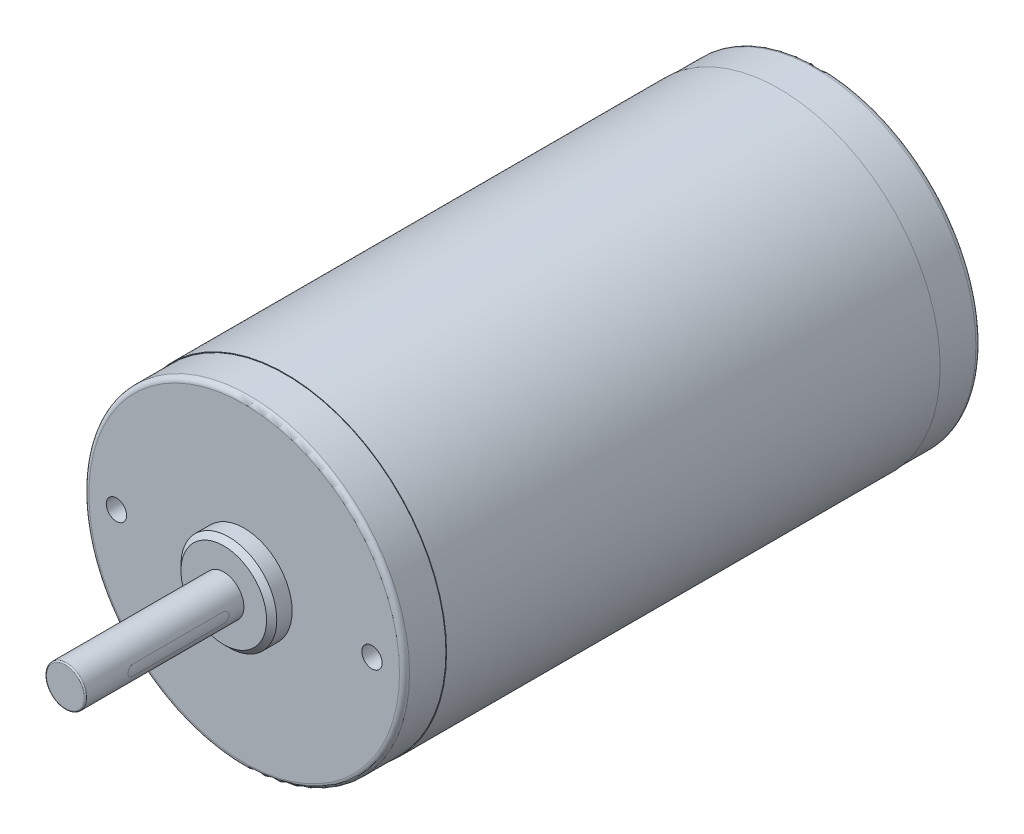
ISO-10303-21;
HEADER;
FILE_DESCRIPTION(('STEP AP214'),'2;1');
FILE_NAME('part.step','',(''),(''),'','','');
FILE_SCHEMA(('AUTOMOTIVE_DESIGN { 1 0 10303 214 1 1 1 1 }'));
ENDSEC;
DATA;
#1=APPLICATION_CONTEXT('core data for automotive mechanical design processes');
#2=APPLICATION_PROTOCOL_DEFINITION('international standard','automotive_design',2000,#1);
#3=PRODUCT_CONTEXT('',#1,'mechanical');
#4=PRODUCT('Part','Part','',(#3));
#5=PRODUCT_RELATED_PRODUCT_CATEGORY('part','',(#4));
#6=PRODUCT_DEFINITION_FORMATION('','',#4);
#7=PRODUCT_DEFINITION_CONTEXT('part definition',#1,'design');
#8=PRODUCT_DEFINITION('design','',#6,#7);
#9=PRODUCT_DEFINITION_SHAPE('','',#8);
#10=(LENGTH_UNIT() NAMED_UNIT(*) SI_UNIT(.MILLI.,.METRE.));
#11=(NAMED_UNIT(*) PLANE_ANGLE_UNIT() SI_UNIT($,.RADIAN.));
#12=(NAMED_UNIT(*) SI_UNIT($,.STERADIAN.) SOLID_ANGLE_UNIT());
#13=UNCERTAINTY_MEASURE_WITH_UNIT(LENGTH_MEASURE(1.E-05),#10,'distance_accuracy_value','');
#14=(GEOMETRIC_REPRESENTATION_CONTEXT(3) GLOBAL_UNCERTAINTY_ASSIGNED_CONTEXT((#13)) GLOBAL_UNIT_ASSIGNED_CONTEXT((#10,
#11,#12)) REPRESENTATION_CONTEXT('',''));
#15=CARTESIAN_POINT('',(0.,0.,0.));
#16=DIRECTION('',(0.,0.,1.));
#17=DIRECTION('',(1.,0.,0.));
#18=AXIS2_PLACEMENT_3D('',#15,#16,#17);
#19=CARTESIAN_POINT('',(35.56,109.2962,10.8204000000007));
#20=DIRECTION('',(0.,0.,-1.));
#21=DIRECTION('',(-1.,0.,0.));
#22=AXIS2_PLACEMENT_3D('',#19,#20,#21);
#23=CYLINDRICAL_SURFACE('',#22,32.0040000000005);
#24=CARTESIAN_POINT('',(35.56,109.2962,10.8204000000007));
#25=DIRECTION('',(0.,0.,-1.));
#26=DIRECTION('',(-1.,0.,0.));
#27=AXIS2_PLACEMENT_3D('',#24,#25,#26);
#28=CIRCLE('',#27,32.0040000000005);
#29=CARTESIAN_POINT('',(3.5559999999995,109.2962,10.8204000000007));
#30=VERTEX_POINT('',#29);
#31=EDGE_CURVE('P0_E179',#30,#30,#28,.T.);
#32=ORIENTED_EDGE('',*,*,#31,.T.);
#33=EDGE_LOOP('',(#32));
#34=FACE_BOUND('',#33,.T.);
#35=CARTESIAN_POINT('',(35.56,109.2962,-87.325199999998));
#36=DIRECTION('',(0.,0.,-1.));
#37=DIRECTION('',(-1.,0.,0.));
#38=AXIS2_PLACEMENT_3D('',#35,#36,#37);
#39=CIRCLE('',#38,32.0040000000005);
#40=CARTESIAN_POINT('',(3.5559999999995,109.2962,-87.325199999998));
#41=VERTEX_POINT('',#40);
#42=EDGE_CURVE('P0_E176',#41,#41,#39,.T.);
#43=ORIENTED_EDGE('',*,*,#42,.F.);
#44=EDGE_LOOP('',(#43));
#45=FACE_BOUND('',#44,.T.);
#46=ADVANCED_FACE('P0_F37',(#34,#45),#23,.T.);
#47=CARTESIAN_POINT('',(67.5640000000005,109.2962,10.8204000000007));
#48=DIRECTION('',(0.,0.,1.));
#49=DIRECTION('',(1.,0.,0.));
#50=AXIS2_PLACEMENT_3D('',#47,#48,#49);
#51=PLANE('',#50);
#52=CARTESIAN_POINT('',(35.56,109.2962,10.8204000000007));
#53=DIRECTION('',(0.,0.,1.));
#54=DIRECTION('',(1.,0.,0.));
#55=AXIS2_PLACEMENT_3D('',#52,#53,#54);
#56=CIRCLE('',#55,31.8770000000005);
#57=CARTESIAN_POINT('',(67.4370000000005,109.2962,10.8204000000007));
#58=VERTEX_POINT('',#57);
#59=EDGE_CURVE('P0_E167',#58,#58,#56,.T.);
#60=ORIENTED_EDGE('',*,*,#59,.F.);
#61=EDGE_LOOP('',(#60));
#62=FACE_BOUND('',#61,.T.);
#63=ORIENTED_EDGE('',*,*,#31,.F.);
#64=EDGE_LOOP('',(#63));
#65=FACE_BOUND('',#64,.T.);
#66=ADVANCED_FACE('P0_F226',(#62,#65),#51,.T.);
#67=CARTESIAN_POINT('',(35.56,109.2962,-87.325199999998));
#68=DIRECTION('',(0.,0.,-1.));
#69=DIRECTION('',(-1.,0.,0.));
#70=AXIS2_PLACEMENT_3D('',#67,#68,#69);
#71=PLANE('',#70);
#72=CARTESIAN_POINT('',(35.56,109.2962,-87.325199999998));
#73=DIRECTION('',(0.,0.,-1.));
#74=DIRECTION('',(-1.,0.,0.));
#75=AXIS2_PLACEMENT_3D('',#72,#73,#74);
#76=CIRCLE('',#75,31.8770000000005);
#77=CARTESIAN_POINT('',(3.68299999999951,109.2962,-87.325199999998));
#78=VERTEX_POINT('',#77);
#79=EDGE_CURVE('P0_E173',#78,#78,#76,.T.);
#80=ORIENTED_EDGE('',*,*,#79,.F.);
#81=EDGE_LOOP('',(#80));
#82=FACE_BOUND('',#81,.T.);
#83=ORIENTED_EDGE('',*,*,#42,.T.);
#84=EDGE_LOOP('',(#83));
#85=FACE_BOUND('',#84,.T.);
#86=ADVANCED_FACE('P0_F232',(#82,#85),#71,.T.);
#87=CARTESIAN_POINT('',(35.56,109.2962,-95.554799999998));
#88=DIRECTION('',(0.,0.,1.));
#89=DIRECTION('',(1.,0.,0.));
#90=AXIS2_PLACEMENT_3D('',#87,#88,#89);
#91=CYLINDRICAL_SURFACE('',#90,31.8770000000005);
#92=CARTESIAN_POINT('',(35.56,109.2962,-94.554799999998));
#93=DIRECTION('',(0.,0.,-1.));
#94=DIRECTION('',(-1.,0.,0.));
#95=AXIS2_PLACEMENT_3D('',#92,#93,#94);
#96=CIRCLE('',#95,31.8770000000005);
#97=CARTESIAN_POINT('',(3.68299999999951,109.2962,-94.554799999998));
#98=VERTEX_POINT('',#97);
#99=EDGE_CURVE('P0_E209',#98,#98,#96,.F.);
#100=ORIENTED_EDGE('',*,*,#99,.T.);
#101=EDGE_LOOP('',(#100));
#102=FACE_BOUND('',#101,.T.);
#103=ORIENTED_EDGE('',*,*,#79,.T.);
#104=EDGE_LOOP('',(#103));
#105=FACE_BOUND('',#104,.T.);
#106=ADVANCED_FACE('P0_F290',(#102,#105),#91,.T.);
#107=CARTESIAN_POINT('',(35.56,109.2962,-95.554799999998));
#108=DIRECTION('',(0.,0.,-1.));
#109=DIRECTION('',(-1.,0.,0.));
#110=AXIS2_PLACEMENT_3D('',#107,#108,#109);
#111=PLANE('',#110);
#112=CARTESIAN_POINT('',(35.56,109.2962,-95.554799999998));
#113=DIRECTION('',(0.,0.,-1.));
#114=DIRECTION('',(-1.,0.,0.));
#115=AXIS2_PLACEMENT_3D('',#112,#113,#114);
#116=CIRCLE('',#115,30.8770000000005);
#117=CARTESIAN_POINT('',(4.6829999999995,109.2962,-95.554799999998));
#118=VERTEX_POINT('',#117);
#119=EDGE_CURVE('P0_E206',#118,#118,#116,.T.);
#120=ORIENTED_EDGE('',*,*,#119,.T.);
#121=EDGE_LOOP('',(#120));
#122=FACE_BOUND('',#121,.T.);
#123=CARTESIAN_POINT('',(46.76735963712,127.903290682857,-95.554799999998));
#124=DIRECTION('',(0.,0.,-1.));
#125=DIRECTION('',(-1.,0.,0.));
#126=AXIS2_PLACEMENT_3D('',#123,#124,#125);
#127=CIRCLE('',#126,4.31800000197918);
#128=CARTESIAN_POINT('',(42.4493596351408,127.903290682857,-95.554799999998));
#129=VERTEX_POINT('',#128);
#130=EDGE_CURVE('P0_E185',#129,#129,#127,.T.);
#131=ORIENTED_EDGE('',*,*,#130,.F.);
#132=EDGE_LOOP('',(#131));
#133=FACE_BOUND('',#132,.T.);
#134=CARTESIAN_POINT('',(54.1670906808811,120.503559639095,-95.554799999998));
#135=DIRECTION('',(0.,0.,-1.));
#136=DIRECTION('',(-1.,0.,0.));
#137=AXIS2_PLACEMENT_3D('',#134,#135,#136);
#138=CIRCLE('',#137,4.3180000019652);
#139=CARTESIAN_POINT('',(49.8490906789159,120.503559639095,-95.554799999998));
#140=VERTEX_POINT('',#139);
#141=EDGE_CURVE('P0_E182',#140,#140,#138,.T.);
#142=ORIENTED_EDGE('',*,*,#141,.F.);
#143=EDGE_LOOP('',(#142));
#144=FACE_BOUND('',#143,.T.);
#145=CARTESIAN_POINT('',(35.56,109.2962,-95.554799999998));
#146=DIRECTION('',(0.,0.,-1.));
#147=DIRECTION('',(-1.,0.,0.));
#148=AXIS2_PLACEMENT_3D('',#145,#146,#147);
#149=CIRCLE('',#148,15.0368000000003);
#150=CARTESIAN_POINT('',(20.5231999999997,109.2962,-95.554799999998));
#151=VERTEX_POINT('',#150);
#152=EDGE_CURVE('P0_E170',#151,#151,#149,.T.);
#153=ORIENTED_EDGE('',*,*,#152,.F.);
#154=EDGE_LOOP('',(#153));
#155=FACE_BOUND('',#154,.T.);
#156=ADVANCED_FACE('P0_F286',(#122,#133,#144,#155),#111,.T.);
#157=CARTESIAN_POINT('',(35.56,109.2962,-100.317299999998));
#158=DIRECTION('',(0.,0.,1.));
#159=DIRECTION('',(1.,0.,0.));
#160=AXIS2_PLACEMENT_3D('',#157,#158,#159);
#161=CYLINDRICAL_SURFACE('',#160,15.0368000000003);
#162=CARTESIAN_POINT('',(35.56,109.2962,-99.317299999998));
#163=DIRECTION('',(0.,0.,-1.));
#164=DIRECTION('',(-1.,0.,0.));
#165=AXIS2_PLACEMENT_3D('',#162,#163,#164);
#166=CIRCLE('',#165,15.0368000000003);
#167=CARTESIAN_POINT('',(20.5231999999997,109.2962,-99.317299999998));
#168=VERTEX_POINT('',#167);
#169=EDGE_CURVE('P0_E11',#168,#168,#166,.F.);
#170=ORIENTED_EDGE('',*,*,#169,.T.);
#171=EDGE_LOOP('',(#170));
#172=FACE_BOUND('',#171,.T.);
#173=ORIENTED_EDGE('',*,*,#152,.T.);
#174=EDGE_LOOP('',(#173));
#175=FACE_BOUND('',#174,.T.);
#176=ADVANCED_FACE('P0_F283',(#172,#175),#161,.T.);
#177=CARTESIAN_POINT('',(35.56,109.2962,-100.317299999998));
#178=DIRECTION('',(0.,0.,-1.));
#179=DIRECTION('',(-1.,0.,0.));
#180=AXIS2_PLACEMENT_3D('',#177,#178,#179);
#181=PLANE('',#180);
#182=CARTESIAN_POINT('',(35.56,109.2962,-100.317299999998));
#183=DIRECTION('',(0.,0.,-1.));
#184=DIRECTION('',(-1.,0.,0.));
#185=AXIS2_PLACEMENT_3D('',#182,#183,#184);
#186=CIRCLE('',#185,14.0368000000003);
#187=CARTESIAN_POINT('',(21.5231999999997,109.2962,-100.317299999998));
#188=VERTEX_POINT('',#187);
#189=EDGE_CURVE('P0_E45',#188,#188,#186,.T.);
#190=ORIENTED_EDGE('',*,*,#189,.T.);
#191=EDGE_LOOP('',(#190));
#192=FACE_BOUND('',#191,.T.);
#193=ADVANCED_FACE('P0_F214',(#192),#181,.T.);
#194=CARTESIAN_POINT('',(35.56,109.2962,19.05));
#195=DIRECTION('',(0.,0.,-1.));
#196=DIRECTION('',(-1.,0.,0.));
#197=AXIS2_PLACEMENT_3D('',#194,#195,#196);
#198=CYLINDRICAL_SURFACE('',#197,31.8770000000005);
#199=CARTESIAN_POINT('',(35.56,109.2962,18.05));
#200=DIRECTION('',(0.,0.,1.));
#201=DIRECTION('',(1.,0.,0.));
#202=AXIS2_PLACEMENT_3D('',#199,#200,#201);
#203=CIRCLE('',#202,31.8770000000005);
#204=CARTESIAN_POINT('',(67.4370000000005,109.2962,18.05));
#205=VERTEX_POINT('',#204);
#206=EDGE_CURVE('P0_E203',#205,#205,#203,.F.);
#207=ORIENTED_EDGE('',*,*,#206,.T.);
#208=EDGE_LOOP('',(#207));
#209=FACE_BOUND('',#208,.T.);
#210=ORIENTED_EDGE('',*,*,#59,.T.);
#211=EDGE_LOOP('',(#210));
#212=FACE_BOUND('',#211,.T.);
#213=ADVANCED_FACE('P0_F258',(#209,#212),#198,.T.);
#214=CARTESIAN_POINT('',(35.56,109.2962,19.05));
#215=DIRECTION('',(0.,0.,1.));
#216=DIRECTION('',(1.,0.,0.));
#217=AXIS2_PLACEMENT_3D('',#214,#215,#216);
#218=PLANE('',#217);
#219=CARTESIAN_POINT('',(35.56,109.2962,19.05));
#220=DIRECTION('',(0.,0.,1.));
#221=DIRECTION('',(1.,0.,0.));
#222=AXIS2_PLACEMENT_3D('',#219,#220,#221);
#223=CIRCLE('',#222,30.8770000000005);
#224=CARTESIAN_POINT('',(66.4370000000005,109.2962,19.05));
#225=VERTEX_POINT('',#224);
#226=EDGE_CURVE('P0_E200',#225,#225,#223,.T.);
#227=ORIENTED_EDGE('',*,*,#226,.T.);
#228=EDGE_LOOP('',(#227));
#229=FACE_BOUND('',#228,.T.);
#230=CARTESIAN_POINT('',(10.1599999999994,109.2962,19.05));
#231=DIRECTION('',(0.,0.,1.));
#232=DIRECTION('',(1.,0.,0.));
#233=AXIS2_PLACEMENT_3D('',#230,#231,#232);
#234=CIRCLE('',#233,2.01930000000002);
#235=CARTESIAN_POINT('',(12.1792999999994,109.2962,19.05));
#236=VERTEX_POINT('',#235);
#237=EDGE_CURVE('P0_E94',#236,#236,#234,.T.);
#238=ORIENTED_EDGE('',*,*,#237,.F.);
#239=EDGE_LOOP('',(#238));
#240=FACE_BOUND('',#239,.T.);
#241=CARTESIAN_POINT('',(60.96,109.2962,19.05));
#242=DIRECTION('',(0.,0.,1.));
#243=DIRECTION('',(1.,0.,0.));
#244=AXIS2_PLACEMENT_3D('',#241,#242,#243);
#245=CIRCLE('',#244,2.01930000000002);
#246=CARTESIAN_POINT('',(62.9793,109.2962,19.05));
#247=VERTEX_POINT('',#246);
#248=EDGE_CURVE('P0_E93',#247,#247,#245,.T.);
#249=ORIENTED_EDGE('',*,*,#248,.F.);
#250=EDGE_LOOP('',(#249));
#251=FACE_BOUND('',#250,.T.);
#252=CARTESIAN_POINT('',(35.56,109.2962,19.05));
#253=DIRECTION('',(0.,0.,1.));
#254=DIRECTION('',(1.,0.,0.));
#255=AXIS2_PLACEMENT_3D('',#252,#253,#254);
#256=CIRCLE('',#255,9.52500000000019);
#257=CARTESIAN_POINT('',(45.0850000000002,109.2962,19.05));
#258=VERTEX_POINT('',#257);
#259=EDGE_CURVE('P0_E164',#258,#258,#256,.T.);
#260=ORIENTED_EDGE('',*,*,#259,.F.);
#261=EDGE_LOOP('',(#260));
#262=FACE_BOUND('',#261,.T.);
#263=ADVANCED_FACE('P0_F254',(#229,#240,#251,#262),#218,.T.);
#264=CARTESIAN_POINT('',(35.56,109.2962,23.114));
#265=DIRECTION('',(0.,0.,-1.));
#266=DIRECTION('',(-1.,0.,0.));
#267=AXIS2_PLACEMENT_3D('',#264,#265,#266);
#268=CYLINDRICAL_SURFACE('',#267,9.52500000000019);
#269=CARTESIAN_POINT('',(35.56,109.2962,22.0980000018232));
#270=DIRECTION('',(0.,0.,1.));
#271=DIRECTION('',(1.,0.,0.));
#272=AXIS2_PLACEMENT_3D('',#269,#270,#271);
#273=CIRCLE('',#272,9.52500000000019);
#274=CARTESIAN_POINT('',(45.0850000000002,109.2962,22.0980000018232));
#275=VERTEX_POINT('',#274);
#276=EDGE_CURVE('P0_E191',#275,#275,#273,.F.);
#277=ORIENTED_EDGE('',*,*,#276,.T.);
#278=EDGE_LOOP('',(#277));
#279=FACE_BOUND('',#278,.T.);
#280=ORIENTED_EDGE('',*,*,#259,.T.);
#281=EDGE_LOOP('',(#280));
#282=FACE_BOUND('',#281,.T.);
#283=ADVANCED_FACE('P0_F257',(#279,#282),#268,.T.);
#284=CARTESIAN_POINT('',(35.56,109.2962,23.114));
#285=DIRECTION('',(0.,0.,1.));
#286=DIRECTION('',(1.,0.,0.));
#287=AXIS2_PLACEMENT_3D('',#284,#285,#286);
#288=PLANE('',#287);
#289=CARTESIAN_POINT('',(35.56,109.2962,23.114));
#290=DIRECTION('',(0.,0.,1.));
#291=DIRECTION('',(1.,0.,0.));
#292=AXIS2_PLACEMENT_3D('',#289,#290,#291);
#293=CIRCLE('',#292,8.50899999999979);
#294=CARTESIAN_POINT('',(44.0689999999998,109.2962,23.114));
#295=VERTEX_POINT('',#294);
#296=EDGE_CURVE('P0_E188',#295,#295,#293,.T.);
#297=ORIENTED_EDGE('',*,*,#296,.T.);
#298=EDGE_LOOP('',(#297));
#299=FACE_BOUND('',#298,.T.);
#300=CARTESIAN_POINT('',(35.56,109.2962,23.114));
#301=DIRECTION('',(0.,0.,1.));
#302=DIRECTION('',(1.,0.,0.));
#303=AXIS2_PLACEMENT_3D('',#300,#301,#302);
#304=CIRCLE('',#303,4.00000000000007);
#305=CARTESIAN_POINT('',(39.5600000000001,109.2962,23.114));
#306=VERTEX_POINT('',#305);
#307=EDGE_CURVE('P0_E120',#306,#306,#304,.T.);
#308=ORIENTED_EDGE('',*,*,#307,.F.);
#309=EDGE_LOOP('',(#308));
#310=FACE_BOUND('',#309,.T.);
#311=ADVANCED_FACE('P0_F267',(#299,#310),#288,.T.);
#312=CARTESIAN_POINT('',(35.56,109.2962,54.614));
#313=DIRECTION('',(0.,0.,-1.));
#314=DIRECTION('',(-1.,0.,0.));
#315=AXIS2_PLACEMENT_3D('',#312,#313,#314);
#316=CYLINDRICAL_SURFACE('',#315,4.00000000000007);
#317=CARTESIAN_POINT('',(35.56,109.2962,54.36));
#318=DIRECTION('',(0.,0.,1.));
#319=DIRECTION('',(1.,0.,0.));
#320=AXIS2_PLACEMENT_3D('',#317,#318,#319);
#321=CIRCLE('',#320,4.00000000000007);
#322=CARTESIAN_POINT('',(39.5600000000001,109.2962,54.36));
#323=VERTEX_POINT('',#322);
#324=EDGE_CURVE('P0_E197',#323,#323,#321,.F.);
#325=ORIENTED_EDGE('',*,*,#324,.T.);
#326=EDGE_LOOP('',(#325));
#327=FACE_BOUND('',#326,.T.);
#328=DIRECTION('',(0.,0.,-1.));
#329=VECTOR('',#328,1.);
#330=CARTESIAN_POINT('',(39.4197279696891,110.3462,54.614));
#331=LINE('',#330,#329);
#332=CARTESIAN_POINT('',(39.4197279696891,110.3462,45.1));
#333=VERTEX_POINT('',#332);
#334=CARTESIAN_POINT('',(39.4197279696891,110.3462,27.1));
#335=VERTEX_POINT('',#334);
#336=EDGE_CURVE('P0_E130',#333,#335,#331,.T.);
#337=ORIENTED_EDGE('',*,*,#336,.T.);
#338=CARTESIAN_POINT('',(39.4197279696891,110.3462,27.1));
#339=CARTESIAN_POINT('',(39.4197258950768,110.34620041025,27.0710051009623));
#340=CARTESIAN_POINT('',(39.4200551064329,110.344998227256,27.0420246228058));
#341=CARTESIAN_POINT('',(39.4213547123988,110.340206209835,26.9842814282389));
#342=CARTESIAN_POINT('',(39.4223249908093,110.336616808112,26.9555186733196));
#343=CARTESIAN_POINT('',(39.4261578920524,110.322321932764,26.8699951160553));
#344=CARTESIAN_POINT('',(39.4299428342912,110.308089542303,26.8138236492985));
#345=CARTESIAN_POINT('',(39.4395286889104,110.270686835054,26.7047742036821));
#346=CARTESIAN_POINT('',(39.445329326456,110.247517736714,26.6518957769836));
#347=CARTESIAN_POINT('',(39.4582892232805,110.192930496084,26.5507488556207));
#348=CARTESIAN_POINT('',(39.4654488628844,110.161510043656,26.5024816571346));
#349=CARTESIAN_POINT('',(39.4805119710478,110.090509636998,26.4107922298844));
#350=CARTESIAN_POINT('',(39.4884281885094,110.050767743087,26.3674975328551));
#351=CARTESIAN_POINT('',(39.5040047400555,109.964586854037,26.2880931254825));
#352=CARTESIAN_POINT('',(39.5116649818293,109.91814547434,26.2519859843525));
#353=CARTESIAN_POINT('',(39.526010604883,109.818987620195,26.1874496103786));
#354=CARTESIAN_POINT('',(39.5326785635433,109.766183168704,26.159151481312));
#355=CARTESIAN_POINT('',(39.5441298010583,109.656397945762,26.1119111599868));
#356=CARTESIAN_POINT('',(39.5489153447307,109.599422291421,26.0929577177131));
#357=CARTESIAN_POINT('',(39.5549473168842,109.501171577289,26.0693758272655));
#358=CARTESIAN_POINT('',(39.5568321627736,109.46054623456,26.0621227253234));
#359=CARTESIAN_POINT('',(39.5593590428507,109.378686103609,26.052433965248));
#360=CARTESIAN_POINT('',(39.560001100914,109.337451327111,26.0499982145665));
#361=CARTESIAN_POINT('',(39.5599984549201,109.238305738357,26.0500025057704));
#362=CARTESIAN_POINT('',(39.5587300938834,109.18037887734,26.0548061723029));
#363=CARTESIAN_POINT('',(39.5537908073877,109.066174828257,26.0738680806171));
#364=CARTESIAN_POINT('',(39.5501176251492,109.009899241695,26.0881352034471));
#365=CARTESIAN_POINT('',(39.5407752151886,108.900688958064,26.1256289904428));
#366=CARTESIAN_POINT('',(39.5351088856793,108.847749541003,26.148842650214));
#367=CARTESIAN_POINT('',(39.5223803452478,108.746519851806,26.2035277086069));
#368=CARTESIAN_POINT('',(39.5153181479083,108.698229534436,26.2349990268771));
#369=CARTESIAN_POINT('',(39.5003832391547,108.606575585264,26.3060552920619));
#370=CARTESIAN_POINT('',(39.4924970081334,108.563331555532,26.3457916691671));
#371=CARTESIAN_POINT('',(39.4768899553604,108.484036309153,26.431929982209));
#372=CARTESIAN_POINT('',(39.4691691622905,108.447986330864,26.4783330633665));
#373=CARTESIAN_POINT('',(39.4546281048764,108.383519395399,26.5774412854526));
#374=CARTESIAN_POINT('',(39.447825217303,108.355241372008,26.6302394851058));
#375=CARTESIAN_POINT('',(39.4360941322255,108.308025058775,26.7400354515098));
#376=CARTESIAN_POINT('',(39.4311644713835,108.289079475123,26.7970298984879));
#377=CARTESIAN_POINT('',(39.424947536189,108.265530062073,26.8952701656664));
#378=CARTESIAN_POINT('',(39.4230031721686,108.258293447667,26.9358624533813));
#379=CARTESIAN_POINT('',(39.4203876966156,108.248624950633,27.0176289590907));
#380=CARTESIAN_POINT('',(39.419715789786,108.246190066839,27.058802797386));
#381=CARTESIAN_POINT('',(39.4197279696891,108.2462,27.1));
#382=B_SPLINE_CURVE_WITH_KNOTS('',3,(#338,#339,#340,#341,#342,#343,#344,#345,#346,#347,#348,
#349,#350,#351,#352,#353,#354,#355,#356,#357,#358,#359,#360,#361,#362,#363,#364,#365,#366,#367,
#368,#369,#370,#371,#372,#373,#374,#375,#376,#377,#378,#379,#380,#381),.UNSPECIFIED.,.F.,.F.,(4,
2,2,2,2,2,2,2,2,2,2,2,2,2,2,2,2,2,2,2,2,4),(0.,0.0869295778834455,0.173843403286115,
0.347151826879623,0.520436629596136,0.693769998810197,0.870856390838592,1.0480059697082,
1.22797015523124,1.40771715061754,1.53136439682191,1.65500926755904,1.82853892099358,
2.00223165541559,2.17567286221396,2.34911238140168,2.52606492372391,2.7030478997598,
2.88301467869372,3.06284057971519,3.18638852057381,3.30985921734618),.UNSPECIFIED.);
#383=CARTESIAN_POINT('',(39.4197279696891,108.2462,27.1));
#384=VERTEX_POINT('',#383);
#385=EDGE_CURVE('P0_E116',#335,#384,#382,.T.);
#386=ORIENTED_EDGE('',*,*,#385,.T.);
#387=DIRECTION('',(0.,0.,-1.));
#388=VECTOR('',#387,1.);
#389=CARTESIAN_POINT('',(39.4197279696891,108.2462,54.614));
#390=LINE('',#389,#388);
#391=CARTESIAN_POINT('',(39.4197279696891,108.2462,45.1));
#392=VERTEX_POINT('',#391);
#393=EDGE_CURVE('P0_E143',#384,#392,#390,.F.);
#394=ORIENTED_EDGE('',*,*,#393,.T.);
#395=CARTESIAN_POINT('',(39.4197279696891,108.2462,45.1));
#396=CARTESIAN_POINT('',(39.4197258950768,108.24619958975,45.1289948990377));
#397=CARTESIAN_POINT('',(39.4200551064328,108.247401772744,45.1579753771942));
#398=CARTESIAN_POINT('',(39.4213547123988,108.252193790165,45.2157185717611));
#399=CARTESIAN_POINT('',(39.4223249908093,108.255783191888,45.2444813266804));
#400=CARTESIAN_POINT('',(39.4261578920524,108.270078067236,45.3300048839447));
#401=CARTESIAN_POINT('',(39.4299428342912,108.284310457697,45.3861763507014));
#402=CARTESIAN_POINT('',(39.4395286889104,108.321713164946,45.4952257963179));
#403=CARTESIAN_POINT('',(39.445329326456,108.344882263286,45.5481042230163));
#404=CARTESIAN_POINT('',(39.4582892232805,108.399469503916,45.6492511443793));
#405=CARTESIAN_POINT('',(39.4654488628844,108.430889956344,45.6975183428654));
#406=CARTESIAN_POINT('',(39.4805119710478,108.501890363002,45.7892077701155));
#407=CARTESIAN_POINT('',(39.4884281885094,108.541632256913,45.8325024671448));
#408=CARTESIAN_POINT('',(39.5040047400555,108.627813145963,45.9119068745175));
#409=CARTESIAN_POINT('',(39.5116649818293,108.67425452566,45.9480140156475));
#410=CARTESIAN_POINT('',(39.526010604883,108.773412379805,46.0125503896214));
#411=CARTESIAN_POINT('',(39.5326785635433,108.826216831296,46.040848518688));
#412=CARTESIAN_POINT('',(39.5441298010583,108.936002054238,46.0880888400132));
#413=CARTESIAN_POINT('',(39.5489153447307,108.992977708579,46.1070422822868));
#414=CARTESIAN_POINT('',(39.5549473168842,109.091228422711,46.1306241727345));
#415=CARTESIAN_POINT('',(39.5568321627736,109.13185376544,46.1378772746766));
#416=CARTESIAN_POINT('',(39.5593590428507,109.213713896391,46.147566034752));
#417=CARTESIAN_POINT('',(39.560001100914,109.254948672889,46.1500017854335));
#418=CARTESIAN_POINT('',(39.5599984549201,109.354094261643,46.1499974942296));
#419=CARTESIAN_POINT('',(39.5587300938834,109.412021122661,46.1451938276971));
#420=CARTESIAN_POINT('',(39.5537908073877,109.526225171743,46.1261319193829));
#421=CARTESIAN_POINT('',(39.5501176251492,109.582500758305,46.1118647965529));
#422=CARTESIAN_POINT('',(39.5407752151886,109.691711041936,46.0743710095572));
#423=CARTESIAN_POINT('',(39.5351088856793,109.744650458997,46.051157349786));
#424=CARTESIAN_POINT('',(39.5223803452478,109.845880148194,45.9964722913931));
#425=CARTESIAN_POINT('',(39.5153181479083,109.894170465564,45.9650009731229));
#426=CARTESIAN_POINT('',(39.5003832391547,109.985824414736,45.8939447079381));
#427=CARTESIAN_POINT('',(39.4924970081334,110.029068444468,45.8542083308329));
#428=CARTESIAN_POINT('',(39.4768899553604,110.108363690847,45.768070017791));
#429=CARTESIAN_POINT('',(39.4691691622905,110.144413669136,45.7216669366335));
#430=CARTESIAN_POINT('',(39.4546281048764,110.208880604601,45.6225587145474));
#431=CARTESIAN_POINT('',(39.447825217303,110.237158627992,45.5697605148942));
#432=CARTESIAN_POINT('',(39.4360941322255,110.284374941225,45.4599645484902));
#433=CARTESIAN_POINT('',(39.4311644713835,110.303320524877,45.4029701015121));
#434=CARTESIAN_POINT('',(39.424947536189,110.326869937927,45.3047298343336));
#435=CARTESIAN_POINT('',(39.4230031721686,110.334106552333,45.2641375466187));
#436=CARTESIAN_POINT('',(39.4203876966156,110.343775049367,45.1823710409093));
#437=CARTESIAN_POINT('',(39.419715789786,110.346209933161,45.141197202614));
#438=CARTESIAN_POINT('',(39.4197279696891,110.3462,45.1));
#439=B_SPLINE_CURVE_WITH_KNOTS('',3,(#395,#396,#397,#398,#399,#400,#401,#402,#403,#404,#405,
#406,#407,#408,#409,#410,#411,#412,#413,#414,#415,#416,#417,#418,#419,#420,#421,#422,#423,#424,
#425,#426,#427,#428,#429,#430,#431,#432,#433,#434,#435,#436,#437,#438),.UNSPECIFIED.,.F.,.F.,(4,
2,2,2,2,2,2,2,2,2,2,2,2,2,2,2,2,2,2,2,2,4),(0.,0.0869295778834422,0.17384340328612,
0.347151826879625,0.520436629596116,0.69376999881019,0.870856390838584,1.04800596970821,
1.22797015523126,1.40771715061754,1.53136439682193,1.65500926755904,1.82853892099362,
2.0022316554156,2.17567286221397,2.34911238140169,2.52606492372393,2.70304789975981,
2.88301467869373,3.0628405797152,3.18638852057382,3.3098592173462),.UNSPECIFIED.);
#440=EDGE_CURVE('P0_E52',#392,#333,#439,.T.);
#441=ORIENTED_EDGE('',*,*,#440,.T.);
#442=EDGE_LOOP('',(#337,#386,#394,#441));
#443=FACE_BOUND('',#442,.T.);
#444=ORIENTED_EDGE('',*,*,#307,.T.);
#445=EDGE_LOOP('',(#444));
#446=FACE_BOUND('',#445,.T.);
#447=ADVANCED_FACE('P0_F273',(#327,#443,#446),#316,.T.);
#448=CARTESIAN_POINT('',(35.56,109.2962,54.614));
#449=DIRECTION('',(0.,0.,1.));
#450=DIRECTION('',(1.,0.,0.));
#451=AXIS2_PLACEMENT_3D('',#448,#449,#450);
#452=PLANE('',#451);
#453=CARTESIAN_POINT('',(35.56,109.2962,54.614));
#454=DIRECTION('',(0.,0.,1.));
#455=DIRECTION('',(1.,0.,0.));
#456=AXIS2_PLACEMENT_3D('',#453,#454,#455);
#457=CIRCLE('',#456,3.74600000000007);
#458=CARTESIAN_POINT('',(39.3060000000001,109.2962,54.614));
#459=VERTEX_POINT('',#458);
#460=EDGE_CURVE('P0_E194',#459,#459,#457,.T.);
#461=ORIENTED_EDGE('',*,*,#460,.T.);
#462=EDGE_LOOP('',(#461));
#463=FACE_BOUND('',#462,.T.);
#464=ADVANCED_FACE('P0_F483',(#463),#452,.T.);
#465=CARTESIAN_POINT('',(67.5650000000005,109.2962,27.1));
#466=DIRECTION('',(-1.,0.,0.));
#467=DIRECTION('',(0.,0.,1.));
#468=AXIS2_PLACEMENT_3D('',#465,#466,#467);
#469=CYLINDRICAL_SURFACE('',#468,1.05);
#470=ORIENTED_EDGE('',*,*,#385,.F.);
#471=DIRECTION('',(-1.,0.,0.));
#472=VECTOR('',#471,1.);
#473=CARTESIAN_POINT('',(67.5650000000005,110.3462,27.1));
#474=LINE('',#473,#472);
#475=CARTESIAN_POINT('',(38.3600000000001,110.3462,27.1));
#476=VERTEX_POINT('',#475);
#477=EDGE_CURVE('P0_E134',#335,#476,#474,.T.);
#478=ORIENTED_EDGE('',*,*,#477,.T.);
#479=CARTESIAN_POINT('',(38.3600000000001,109.2962,27.1));
#480=DIRECTION('',(-1.,0.,0.));
#481=DIRECTION('',(0.,0.,1.));
#482=AXIS2_PLACEMENT_3D('',#479,#480,#481);
#483=CIRCLE('',#482,1.05);
#484=CARTESIAN_POINT('',(38.3600000000001,108.2462,27.1));
#485=VERTEX_POINT('',#484);
#486=EDGE_CURVE('P0_E127',#476,#485,#483,.T.);
#487=ORIENTED_EDGE('',*,*,#486,.T.);
#488=DIRECTION('',(-1.,0.,0.));
#489=VECTOR('',#488,1.);
#490=CARTESIAN_POINT('',(67.5650000000005,108.2462,27.1));
#491=LINE('',#490,#489);
#492=EDGE_CURVE('P0_E60',#384,#485,#491,.T.);
#493=ORIENTED_EDGE('',*,*,#492,.F.);
#494=EDGE_LOOP('',(#470,#478,#487,#493));
#495=FACE_BOUND('',#494,.T.);
#496=ADVANCED_FACE('P0_F474',(#495),#469,.F.);
#497=CARTESIAN_POINT('',(67.5650000000005,110.3462,45.1));
#498=DIRECTION('',(0.,1.,0.));
#499=DIRECTION('',(0.,0.,1.));
#500=AXIS2_PLACEMENT_3D('',#497,#498,#499);
#501=PLANE('',#500);
#502=ORIENTED_EDGE('',*,*,#336,.F.);
#503=DIRECTION('',(-1.,0.,0.));
#504=VECTOR('',#503,1.);
#505=CARTESIAN_POINT('',(67.5650000000005,110.3462,45.1));
#506=LINE('',#505,#504);
#507=CARTESIAN_POINT('',(38.3600000000001,110.3462,45.1));
#508=VERTEX_POINT('',#507);
#509=EDGE_CURVE('P0_E157',#333,#508,#506,.T.);
#510=ORIENTED_EDGE('',*,*,#509,.T.);
#511=DIRECTION('',(0.,0.,-1.));
#512=VECTOR('',#511,1.);
#513=CARTESIAN_POINT('',(38.3600000000001,110.3462,45.1));
#514=LINE('',#513,#512);
#515=EDGE_CURVE('P0_E117',#508,#476,#514,.T.);
#516=ORIENTED_EDGE('',*,*,#515,.T.);
#517=ORIENTED_EDGE('',*,*,#477,.F.);
#518=EDGE_LOOP('',(#502,#510,#516,#517));
#519=FACE_BOUND('',#518,.T.);
#520=ADVANCED_FACE('P0_F466',(#519),#501,.F.);
#521=CARTESIAN_POINT('',(67.5650000000005,109.2962,45.1));
#522=DIRECTION('',(-1.,0.,0.));
#523=DIRECTION('',(0.,0.,1.));
#524=AXIS2_PLACEMENT_3D('',#521,#522,#523);
#525=CYLINDRICAL_SURFACE('',#524,1.05);
#526=ORIENTED_EDGE('',*,*,#440,.F.);
#527=DIRECTION('',(-1.,0.,0.));
#528=VECTOR('',#527,1.);
#529=CARTESIAN_POINT('',(67.5650000000005,108.2462,45.1));
#530=LINE('',#529,#528);
#531=CARTESIAN_POINT('',(38.3600000000001,108.2462,45.1));
#532=VERTEX_POINT('',#531);
#533=EDGE_CURVE('P0_E129',#392,#532,#530,.T.);
#534=ORIENTED_EDGE('',*,*,#533,.T.);
#535=CARTESIAN_POINT('',(38.3600000000001,109.2962,45.1));
#536=DIRECTION('',(-1.,0.,0.));
#537=DIRECTION('',(0.,0.,1.));
#538=AXIS2_PLACEMENT_3D('',#535,#536,#537);
#539=CIRCLE('',#538,1.05);
#540=EDGE_CURVE('P0_E121',#532,#508,#539,.T.);
#541=ORIENTED_EDGE('',*,*,#540,.T.);
#542=ORIENTED_EDGE('',*,*,#509,.F.);
#543=EDGE_LOOP('',(#526,#534,#541,#542));
#544=FACE_BOUND('',#543,.T.);
#545=ADVANCED_FACE('P0_F458',(#544),#525,.F.);
#546=CARTESIAN_POINT('',(67.5650000000005,108.2462,27.1));
#547=DIRECTION('',(0.,-1.,0.));
#548=DIRECTION('',(0.,0.,-1.));
#549=AXIS2_PLACEMENT_3D('',#546,#547,#548);
#550=PLANE('',#549);
#551=ORIENTED_EDGE('',*,*,#393,.F.);
#552=ORIENTED_EDGE('',*,*,#492,.T.);
#553=DIRECTION('',(0.,0.,1.));
#554=VECTOR('',#553,1.);
#555=CARTESIAN_POINT('',(38.3600000000001,108.2462,27.1));
#556=LINE('',#555,#554);
#557=EDGE_CURVE('P0_E124',#485,#532,#556,.T.);
#558=ORIENTED_EDGE('',*,*,#557,.T.);
#559=ORIENTED_EDGE('',*,*,#533,.F.);
#560=EDGE_LOOP('',(#551,#552,#558,#559));
#561=FACE_BOUND('',#560,.T.);
#562=ADVANCED_FACE('P0_F450',(#561),#550,.F.);
#563=CARTESIAN_POINT('',(38.3600000000001,109.2962,27.1));
#564=DIRECTION('',(-1.,0.,0.));
#565=DIRECTION('',(0.,0.,1.));
#566=AXIS2_PLACEMENT_3D('',#563,#564,#565);
#567=PLANE('',#566);
#568=ORIENTED_EDGE('',*,*,#486,.F.);
#569=ORIENTED_EDGE('',*,*,#515,.F.);
#570=ORIENTED_EDGE('',*,*,#540,.F.);
#571=ORIENTED_EDGE('',*,*,#557,.F.);
#572=EDGE_LOOP('',(#568,#569,#570,#571));
#573=FACE_BOUND('',#572,.T.);
#574=ADVANCED_FACE('P0_F441',(#573),#567,.F.);
#575=CARTESIAN_POINT('',(54.1670906808811,120.503559639095,-95.554799999998));
#576=DIRECTION('',(0.,0.,-1.));
#577=DIRECTION('',(-1.,0.,0.));
#578=AXIS2_PLACEMENT_3D('',#575,#576,#577);
#579=CYLINDRICAL_SURFACE('',#578,4.3180000019652);
#580=ORIENTED_EDGE('',*,*,#141,.T.);
#581=EDGE_LOOP('',(#580));
#582=FACE_BOUND('',#581,.T.);
#583=CARTESIAN_POINT('',(54.1670906808811,120.503559639095,-95.6026999960083));
#584=DIRECTION('',(0.,0.,-1.));
#585=DIRECTION('',(-1.,0.,0.));
#586=AXIS2_PLACEMENT_3D('',#583,#584,#585);
#587=CIRCLE('',#586,4.3180000019652);
#588=CARTESIAN_POINT('',(49.8490906789159,120.503559639095,-95.6026999960083));
#589=VERTEX_POINT('',#588);
#590=EDGE_CURVE('P0_E110',#589,#589,#587,.T.);
#591=ORIENTED_EDGE('',*,*,#590,.F.);
#592=EDGE_LOOP('',(#591));
#593=FACE_BOUND('',#592,.T.);
#594=ADVANCED_FACE('P0_F432',(#582,#593),#579,.T.);
#595=CARTESIAN_POINT('',(54.1670906808811,120.503559639095,-97.8026999980238));
#596=DIRECTION('',(0.,0.,-1.));
#597=DIRECTION('',(-1.,0.,0.));
#598=AXIS2_PLACEMENT_3D('',#595,#596,#597);
#599=PLANE('',#598);
#600=CARTESIAN_POINT('',(54.1670906808811,120.503559639095,-97.8026999980238));
#601=DIRECTION('',(0.,0.,-1.));
#602=DIRECTION('',(-1.,0.,0.));
#603=AXIS2_PLACEMENT_3D('',#600,#601,#602);
#604=CIRCLE('',#603,2.11799999994966);
#605=CARTESIAN_POINT('',(52.0490906809314,120.503559639095,-97.8026999980238));
#606=VERTEX_POINT('',#605);
#607=EDGE_CURVE('P0_E113',#606,#606,#604,.T.);
#608=ORIENTED_EDGE('',*,*,#607,.T.);
#609=EDGE_LOOP('',(#608));
#610=FACE_BOUND('',#609,.T.);
#611=ADVANCED_FACE('P0_F423',(#610),#599,.T.);
#612=CARTESIAN_POINT('',(54.1670906808811,120.503559639095,-97.8026999980238));
#613=DIRECTION('',(0.,0.,1.));
#614=DIRECTION('',(1.,0.,0.));
#615=AXIS2_PLACEMENT_3D('',#612,#613,#614);
#616=CONICAL_SURFACE('',#615,2.11799999994966,0.78539816339745);
#617=ORIENTED_EDGE('',*,*,#590,.T.);
#618=EDGE_LOOP('',(#617));
#619=FACE_BOUND('',#618,.T.);
#620=ORIENTED_EDGE('',*,*,#607,.F.);
#621=EDGE_LOOP('',(#620));
#622=FACE_BOUND('',#621,.T.);
#623=ADVANCED_FACE('P0_F414',(#619,#622),#616,.T.);
#624=CARTESIAN_POINT('',(46.76735963712,127.903290682857,-95.554799999998));
#625=DIRECTION('',(0.,0.,-1.));
#626=DIRECTION('',(-1.,0.,0.));
#627=AXIS2_PLACEMENT_3D('',#624,#625,#626);
#628=CYLINDRICAL_SURFACE('',#627,4.31800000197918);
#629=ORIENTED_EDGE('',*,*,#130,.T.);
#630=EDGE_LOOP('',(#629));
#631=FACE_BOUND('',#630,.T.);
#632=CARTESIAN_POINT('',(46.76735963712,127.903290682857,-95.6026999960785));
#633=DIRECTION('',(0.,0.,-1.));
#634=DIRECTION('',(-1.,0.,0.));
#635=AXIS2_PLACEMENT_3D('',#632,#633,#634);
#636=CIRCLE('',#635,4.31800000197918);
#637=CARTESIAN_POINT('',(42.4493596351408,127.903290682857,-95.6026999960785));
#638=VERTEX_POINT('',#637);
#639=EDGE_CURVE('P0_E104',#638,#638,#636,.T.);
#640=ORIENTED_EDGE('',*,*,#639,.F.);
#641=EDGE_LOOP('',(#640));
#642=FACE_BOUND('',#641,.T.);
#643=ADVANCED_FACE('P0_F405',(#631,#642),#628,.T.);
#644=CARTESIAN_POINT('',(46.76735963712,127.903290682857,-97.8026999980236));
#645=DIRECTION('',(0.,0.,-1.));
#646=DIRECTION('',(-1.,0.,0.));
#647=AXIS2_PLACEMENT_3D('',#644,#645,#646);
#648=PLANE('',#647);
#649=CARTESIAN_POINT('',(46.76735963712,127.903290682857,-97.8026999980236));
#650=DIRECTION('',(0.,0.,-1.));
#651=DIRECTION('',(-1.,0.,0.));
#652=AXIS2_PLACEMENT_3D('',#649,#650,#651);
#653=CIRCLE('',#652,2.11800000003411);
#654=CARTESIAN_POINT('',(44.6493596370859,127.903290682857,-97.8026999980236));
#655=VERTEX_POINT('',#654);
#656=EDGE_CURVE('P0_E107',#655,#655,#653,.T.);
#657=ORIENTED_EDGE('',*,*,#656,.T.);
#658=EDGE_LOOP('',(#657));
#659=FACE_BOUND('',#658,.T.);
#660=ADVANCED_FACE('P0_F396',(#659),#648,.T.);
#661=CARTESIAN_POINT('',(46.76735963712,127.903290682857,-97.8026999980236));
#662=DIRECTION('',(0.,0.,1.));
#663=DIRECTION('',(1.,0.,0.));
#664=AXIS2_PLACEMENT_3D('',#661,#662,#663);
#665=CONICAL_SURFACE('',#664,2.11800000003411,0.785398163397448);
#666=ORIENTED_EDGE('',*,*,#639,.T.);
#667=EDGE_LOOP('',(#666));
#668=FACE_BOUND('',#667,.T.);
#669=ORIENTED_EDGE('',*,*,#656,.F.);
#670=EDGE_LOOP('',(#669));
#671=FACE_BOUND('',#670,.T.);
#672=ADVANCED_FACE('P0_F387',(#668,#671),#665,.T.);
#673=CARTESIAN_POINT('',(60.96,109.2962,5.4356000000007));
#674=DIRECTION('',(0.,0.,1.));
#675=DIRECTION('',(1.,0.,0.));
#676=AXIS2_PLACEMENT_3D('',#673,#674,#675);
#677=CONICAL_SURFACE('',#676,2.01930000000002,1.02974425747654);
#678=CARTESIAN_POINT('',(60.96,109.2962,4.22228214870002));
#679=VERTEX_POINT('',#678);
#680=VERTEX_LOOP('',#679);
#681=FACE_BOUND('',#680,.T.);
#682=CARTESIAN_POINT('',(60.96,109.2962,5.4356000000007));
#683=DIRECTION('',(0.,0.,1.));
#684=DIRECTION('',(1.,0.,0.));
#685=AXIS2_PLACEMENT_3D('',#682,#683,#684);
#686=CIRCLE('',#685,2.01930000000002);
#687=CARTESIAN_POINT('',(62.9793,109.2962,5.4356000000007));
#688=VERTEX_POINT('',#687);
#689=EDGE_CURVE('P0_E97',#688,#688,#686,.T.);
#690=ORIENTED_EDGE('',*,*,#689,.T.);
#691=EDGE_LOOP('',(#690));
#692=FACE_BOUND('',#691,.T.);
#693=ADVANCED_FACE('P0_F378',(#681,#692),#677,.F.);
#694=CARTESIAN_POINT('',(60.96,109.2962,19.05));
#695=DIRECTION('',(0.,0.,1.));
#696=DIRECTION('',(1.,0.,0.));
#697=AXIS2_PLACEMENT_3D('',#694,#695,#696);
#698=CYLINDRICAL_SURFACE('',#697,2.01930000000002);
#699=ORIENTED_EDGE('',*,*,#689,.F.);
#700=EDGE_LOOP('',(#699));
#701=FACE_BOUND('',#700,.T.);
#702=ORIENTED_EDGE('',*,*,#248,.T.);
#703=EDGE_LOOP('',(#702));
#704=FACE_BOUND('',#703,.T.);
#705=ADVANCED_FACE('P0_F87',(#701,#704),#698,.F.);
#706=CARTESIAN_POINT('',(10.1599999999994,109.2962,5.4356000000007));
#707=DIRECTION('',(0.,0.,1.));
#708=DIRECTION('',(1.,0.,0.));
#709=AXIS2_PLACEMENT_3D('',#706,#707,#708);
#710=CONICAL_SURFACE('',#709,2.01930000000002,1.02974425747654);
#711=CARTESIAN_POINT('',(10.1599999999994,109.2962,4.22228214870002));
#712=VERTEX_POINT('',#711);
#713=VERTEX_LOOP('',#712);
#714=FACE_BOUND('',#713,.T.);
#715=CARTESIAN_POINT('',(10.1599999999994,109.2962,5.4356000000007));
#716=DIRECTION('',(0.,0.,1.));
#717=DIRECTION('',(1.,0.,0.));
#718=AXIS2_PLACEMENT_3D('',#715,#716,#717);
#719=CIRCLE('',#718,2.01930000000002);
#720=CARTESIAN_POINT('',(12.1792999999994,109.2962,5.4356000000007));
#721=VERTEX_POINT('',#720);
#722=EDGE_CURVE('P0_E91',#721,#721,#719,.T.);
#723=ORIENTED_EDGE('',*,*,#722,.T.);
#724=EDGE_LOOP('',(#723));
#725=FACE_BOUND('',#724,.T.);
#726=ADVANCED_FACE('P0_F83',(#714,#725),#710,.F.);
#727=CARTESIAN_POINT('',(10.1599999999994,109.2962,19.05));
#728=DIRECTION('',(0.,0.,1.));
#729=DIRECTION('',(1.,0.,0.));
#730=AXIS2_PLACEMENT_3D('',#727,#728,#729);
#731=CYLINDRICAL_SURFACE('',#730,2.01930000000002);
#732=ORIENTED_EDGE('',*,*,#722,.F.);
#733=EDGE_LOOP('',(#732));
#734=FACE_BOUND('',#733,.T.);
#735=ORIENTED_EDGE('',*,*,#237,.T.);
#736=EDGE_LOOP('',(#735));
#737=FACE_BOUND('',#736,.T.);
#738=ADVANCED_FACE('P0_F86',(#734,#737),#731,.F.);
#739=CARTESIAN_POINT('',(35.56,109.2962,23.114));
#740=DIRECTION('',(0.,0.,-1.));
#741=DIRECTION('',(-1.,0.,0.));
#742=AXIS2_PLACEMENT_3D('',#739,#740,#741);
#743=CONICAL_SURFACE('',#742,8.50899999999979,0.785398164294876);
#744=ORIENTED_EDGE('',*,*,#276,.F.);
#745=EDGE_LOOP('',(#744));
#746=FACE_BOUND('',#745,.T.);
#747=ORIENTED_EDGE('',*,*,#296,.F.);
#748=EDGE_LOOP('',(#747));
#749=FACE_BOUND('',#748,.T.);
#750=ADVANCED_FACE('P0_F238',(#746,#749),#743,.T.);
#751=CARTESIAN_POINT('',(35.56,109.2962,54.36));
#752=DIRECTION('',(0.,0.,1.));
#753=DIRECTION('',(1.,0.,0.));
#754=AXIS2_PLACEMENT_3D('',#751,#752,#753);
#755=TOROIDAL_SURFACE('',#754,3.74600000000007,0.254000000000003);
#756=ORIENTED_EDGE('',*,*,#324,.F.);
#757=EDGE_LOOP('',(#756));
#758=FACE_BOUND('',#757,.T.);
#759=ORIENTED_EDGE('',*,*,#460,.F.);
#760=EDGE_LOOP('',(#759));
#761=FACE_BOUND('',#760,.T.);
#762=ADVANCED_FACE('P0_F241',(#758,#761),#755,.T.);
#763=CARTESIAN_POINT('',(35.56,109.2962,18.05));
#764=DIRECTION('',(0.,0.,1.));
#765=DIRECTION('',(1.,0.,0.));
#766=AXIS2_PLACEMENT_3D('',#763,#764,#765);
#767=TOROIDAL_SURFACE('',#766,30.8770000000005,0.999999999999998);
#768=ORIENTED_EDGE('',*,*,#206,.F.);
#769=EDGE_LOOP('',(#768));
#770=FACE_BOUND('',#769,.T.);
#771=ORIENTED_EDGE('',*,*,#226,.F.);
#772=EDGE_LOOP('',(#771));
#773=FACE_BOUND('',#772,.T.);
#774=ADVANCED_FACE('P0_F222',(#770,#773),#767,.T.);
#775=CARTESIAN_POINT('',(35.56,109.2962,-94.554799999998));
#776=DIRECTION('',(0.,0.,-1.));
#777=DIRECTION('',(-1.,0.,0.));
#778=AXIS2_PLACEMENT_3D('',#775,#776,#777);
#779=TOROIDAL_SURFACE('',#778,30.8770000000005,0.999999999999998);
#780=ORIENTED_EDGE('',*,*,#99,.F.);
#781=EDGE_LOOP('',(#780));
#782=FACE_BOUND('',#781,.T.);
#783=ORIENTED_EDGE('',*,*,#119,.F.);
#784=EDGE_LOOP('',(#783));
#785=FACE_BOUND('',#784,.T.);
#786=ADVANCED_FACE('P0_F217',(#782,#785),#779,.T.);
#787=CARTESIAN_POINT('',(35.56,109.2962,-99.317299999998));
#788=DIRECTION('',(0.,0.,-1.));
#789=DIRECTION('',(-1.,0.,0.));
#790=AXIS2_PLACEMENT_3D('',#787,#788,#789);
#791=TOROIDAL_SURFACE('',#790,14.0368000000003,0.999999999999998);
#792=ORIENTED_EDGE('',*,*,#169,.F.);
#793=EDGE_LOOP('',(#792));
#794=FACE_BOUND('',#793,.T.);
#795=ORIENTED_EDGE('',*,*,#189,.F.);
#796=EDGE_LOOP('',(#795));
#797=FACE_BOUND('',#796,.T.);
#798=ADVANCED_FACE('P0_F39',(#794,#797),#791,.T.);
#799=CLOSED_SHELL('',(#46,#66,#86,#106,#156,#176,#193,#213,#263,#283,#311,#447,#464,#496,#520,
#545,#562,#574,#594,#611,#623,#643,#660,#672,#693,#705,#726,#738,#750,#762,#774,#786,#798));
#800=MANIFOLD_SOLID_BREP('P0_B2',#799);
#801=CARTESIAN_POINT('',(35.56,109.2962,54.614));
#802=DIRECTION('',(0.,0.,-1.));
#803=DIRECTION('',(-1.,0.,0.));
#804=AXIS2_PLACEMENT_3D('',#801,#802,#803);
#805=CYLINDRICAL_SURFACE('',#804,4.00000000000007);
#806=CARTESIAN_POINT('',(39.4197279696891,108.2462,45.1));
#807=CARTESIAN_POINT('',(39.4197258950768,108.24619958975,45.1289948990377));
#808=CARTESIAN_POINT('',(39.4200551064328,108.247401772744,45.1579753771942));
#809=CARTESIAN_POINT('',(39.4213547123988,108.252193790165,45.2157185717611));
#810=CARTESIAN_POINT('',(39.4223249908093,108.255783191888,45.2444813266804));
#811=CARTESIAN_POINT('',(39.4261578920524,108.270078067236,45.3300048839447));
#812=CARTESIAN_POINT('',(39.4299428342912,108.284310457697,45.3861763507014));
#813=CARTESIAN_POINT('',(39.4395286889104,108.321713164946,45.4952257963179));
#814=CARTESIAN_POINT('',(39.445329326456,108.344882263286,45.5481042230163));
#815=CARTESIAN_POINT('',(39.4582892232805,108.399469503916,45.6492511443793));
#816=CARTESIAN_POINT('',(39.4654488628844,108.430889956344,45.6975183428654));
#817=CARTESIAN_POINT('',(39.4805119710478,108.501890363002,45.7892077701155));
#818=CARTESIAN_POINT('',(39.4884281885094,108.541632256913,45.8325024671448));
#819=CARTESIAN_POINT('',(39.5040047400555,108.627813145963,45.9119068745175));
#820=CARTESIAN_POINT('',(39.5116649818293,108.67425452566,45.9480140156475));
#821=CARTESIAN_POINT('',(39.526010604883,108.773412379805,46.0125503896214));
#822=CARTESIAN_POINT('',(39.5326785635433,108.826216831296,46.040848518688));
#823=CARTESIAN_POINT('',(39.5441298010583,108.936002054238,46.0880888400132));
#824=CARTESIAN_POINT('',(39.5489153447307,108.992977708579,46.1070422822868));
#825=CARTESIAN_POINT('',(39.5549473168842,109.091228422711,46.1306241727345));
#826=CARTESIAN_POINT('',(39.5568321627736,109.13185376544,46.1378772746766));
#827=CARTESIAN_POINT('',(39.5593590428507,109.213713896391,46.147566034752));
#828=CARTESIAN_POINT('',(39.560001100914,109.254948672889,46.1500017854335));
#829=CARTESIAN_POINT('',(39.5599984549201,109.354094261643,46.1499974942296));
#830=CARTESIAN_POINT('',(39.5587300938834,109.412021122661,46.1451938276971));
#831=CARTESIAN_POINT('',(39.5537908073877,109.526225171743,46.1261319193829));
#832=CARTESIAN_POINT('',(39.5501176251492,109.582500758305,46.1118647965529));
#833=CARTESIAN_POINT('',(39.5407752151886,109.691711041936,46.0743710095572));
#834=CARTESIAN_POINT('',(39.5351088856793,109.744650458997,46.051157349786));
#835=CARTESIAN_POINT('',(39.5223803452478,109.845880148194,45.9964722913931));
#836=CARTESIAN_POINT('',(39.5153181479083,109.894170465564,45.9650009731229));
#837=CARTESIAN_POINT('',(39.5003832391547,109.985824414736,45.8939447079381));
#838=CARTESIAN_POINT('',(39.4924970081334,110.029068444468,45.8542083308329));
#839=CARTESIAN_POINT('',(39.4768899553604,110.108363690847,45.768070017791));
#840=CARTESIAN_POINT('',(39.4691691622905,110.144413669136,45.7216669366335));
#841=CARTESIAN_POINT('',(39.4546281048764,110.208880604601,45.6225587145474));
#842=CARTESIAN_POINT('',(39.447825217303,110.237158627992,45.5697605148942));
#843=CARTESIAN_POINT('',(39.4360941322255,110.284374941225,45.4599645484902));
#844=CARTESIAN_POINT('',(39.4311644713835,110.303320524877,45.4029701015121));
#845=CARTESIAN_POINT('',(39.424947536189,110.326869937927,45.3047298343336));
#846=CARTESIAN_POINT('',(39.4230031721686,110.334106552333,45.2641375466187));
#847=CARTESIAN_POINT('',(39.4203876966156,110.343775049367,45.1823710409093));
#848=CARTESIAN_POINT('',(39.419715789786,110.346209933161,45.141197202614));
#849=CARTESIAN_POINT('',(39.4197279696891,110.3462,45.1));
#850=B_SPLINE_CURVE_WITH_KNOTS('',3,(#806,#807,#808,#809,#810,#811,#812,#813,#814,#815,#816,
#817,#818,#819,#820,#821,#822,#823,#824,#825,#826,#827,#828,#829,#830,#831,#832,#833,#834,#835,
#836,#837,#838,#839,#840,#841,#842,#843,#844,#845,#846,#847,#848,#849),.UNSPECIFIED.,.F.,.F.,(4,
2,2,2,2,2,2,2,2,2,2,2,2,2,2,2,2,2,2,2,2,4),(0.,0.0869295778834422,0.17384340328612,
0.347151826879625,0.520436629596116,0.69376999881019,0.870856390838584,1.04800596970821,
1.22797015523126,1.40771715061754,1.53136439682193,1.65500926755904,1.82853892099362,
2.0022316554156,2.17567286221397,2.34911238140169,2.52606492372393,2.70304789975981,
2.88301467869373,3.0628405797152,3.18638852057382,3.3098592173462),.UNSPECIFIED.);
#851=CARTESIAN_POINT('',(39.4197279696891,108.2462,45.1));
#852=VERTEX_POINT('',#851);
#853=CARTESIAN_POINT('',(39.4197279696891,110.3462,45.1));
#854=VERTEX_POINT('',#853);
#855=EDGE_CURVE('P1_E28',#852,#854,#850,.T.);
#856=ORIENTED_EDGE('',*,*,#855,.F.);
#857=DIRECTION('',(0.,0.,-1.));
#858=VECTOR('',#857,1.);
#859=CARTESIAN_POINT('',(39.4197279696891,108.2462,54.614));
#860=LINE('',#859,#858);
#861=CARTESIAN_POINT('',(39.4197279696891,108.2462,27.1));
#862=VERTEX_POINT('',#861);
#863=EDGE_CURVE('P1_E39',#862,#852,#860,.F.);
#864=ORIENTED_EDGE('',*,*,#863,.F.);
#865=CARTESIAN_POINT('',(39.4197279696891,110.3462,27.1));
#866=CARTESIAN_POINT('',(39.4197258950768,110.34620041025,27.0710051009623));
#867=CARTESIAN_POINT('',(39.4200551064329,110.344998227256,27.0420246228058));
#868=CARTESIAN_POINT('',(39.4213547123988,110.340206209835,26.9842814282389));
#869=CARTESIAN_POINT('',(39.4223249908093,110.336616808112,26.9555186733196));
#870=CARTESIAN_POINT('',(39.4261578920524,110.322321932764,26.8699951160553));
#871=CARTESIAN_POINT('',(39.4299428342912,110.308089542303,26.8138236492985));
#872=CARTESIAN_POINT('',(39.4395286889104,110.270686835054,26.7047742036821));
#873=CARTESIAN_POINT('',(39.445329326456,110.247517736714,26.6518957769836));
#874=CARTESIAN_POINT('',(39.4582892232805,110.192930496084,26.5507488556207));
#875=CARTESIAN_POINT('',(39.4654488628844,110.161510043656,26.5024816571346));
#876=CARTESIAN_POINT('',(39.4805119710478,110.090509636998,26.4107922298844));
#877=CARTESIAN_POINT('',(39.4884281885094,110.050767743087,26.3674975328551));
#878=CARTESIAN_POINT('',(39.5040047400555,109.964586854037,26.2880931254825));
#879=CARTESIAN_POINT('',(39.5116649818293,109.91814547434,26.2519859843525));
#880=CARTESIAN_POINT('',(39.526010604883,109.818987620195,26.1874496103786));
#881=CARTESIAN_POINT('',(39.5326785635433,109.766183168704,26.159151481312));
#882=CARTESIAN_POINT('',(39.5441298010583,109.656397945762,26.1119111599868));
#883=CARTESIAN_POINT('',(39.5489153447307,109.599422291421,26.0929577177131));
#884=CARTESIAN_POINT('',(39.5549473168842,109.501171577289,26.0693758272655));
#885=CARTESIAN_POINT('',(39.5568321627736,109.46054623456,26.0621227253234));
#886=CARTESIAN_POINT('',(39.5593590428507,109.378686103609,26.052433965248));
#887=CARTESIAN_POINT('',(39.560001100914,109.337451327111,26.0499982145665));
#888=CARTESIAN_POINT('',(39.5599984549201,109.238305738357,26.0500025057704));
#889=CARTESIAN_POINT('',(39.5587300938834,109.18037887734,26.0548061723029));
#890=CARTESIAN_POINT('',(39.5537908073877,109.066174828257,26.0738680806171));
#891=CARTESIAN_POINT('',(39.5501176251492,109.009899241695,26.0881352034471));
#892=CARTESIAN_POINT('',(39.5407752151886,108.900688958064,26.1256289904428));
#893=CARTESIAN_POINT('',(39.5351088856793,108.847749541003,26.148842650214));
#894=CARTESIAN_POINT('',(39.5223803452478,108.746519851806,26.2035277086069));
#895=CARTESIAN_POINT('',(39.5153181479083,108.698229534436,26.2349990268771));
#896=CARTESIAN_POINT('',(39.5003832391547,108.606575585264,26.3060552920619));
#897=CARTESIAN_POINT('',(39.4924970081334,108.563331555532,26.3457916691671));
#898=CARTESIAN_POINT('',(39.4768899553604,108.484036309153,26.431929982209));
#899=CARTESIAN_POINT('',(39.4691691622905,108.447986330864,26.4783330633665));
#900=CARTESIAN_POINT('',(39.4546281048764,108.383519395399,26.5774412854526));
#901=CARTESIAN_POINT('',(39.447825217303,108.355241372008,26.6302394851058));
#902=CARTESIAN_POINT('',(39.4360941322255,108.308025058775,26.7400354515098));
#903=CARTESIAN_POINT('',(39.4311644713835,108.289079475123,26.7970298984879));
#904=CARTESIAN_POINT('',(39.424947536189,108.265530062073,26.8952701656664));
#905=CARTESIAN_POINT('',(39.4230031721686,108.258293447667,26.9358624533813));
#906=CARTESIAN_POINT('',(39.4203876966156,108.248624950633,27.0176289590907));
#907=CARTESIAN_POINT('',(39.419715789786,108.246190066839,27.058802797386));
#908=CARTESIAN_POINT('',(39.4197279696891,108.2462,27.1));
#909=B_SPLINE_CURVE_WITH_KNOTS('',3,(#865,#866,#867,#868,#869,#870,#871,#872,#873,#874,#875,
#876,#877,#878,#879,#880,#881,#882,#883,#884,#885,#886,#887,#888,#889,#890,#891,#892,#893,#894,
#895,#896,#897,#898,#899,#900,#901,#902,#903,#904,#905,#906,#907,#908),.UNSPECIFIED.,.F.,.F.,(4,
2,2,2,2,2,2,2,2,2,2,2,2,2,2,2,2,2,2,2,2,4),(0.,0.0869295778834455,0.173843403286115,
0.347151826879623,0.520436629596136,0.693769998810197,0.870856390838592,1.0480059697082,
1.22797015523124,1.40771715061754,1.53136439682191,1.65500926755904,1.82853892099358,
2.00223165541559,2.17567286221396,2.34911238140168,2.52606492372391,2.7030478997598,
2.88301467869372,3.06284057971519,3.18638852057381,3.30985921734618),.UNSPECIFIED.);
#910=CARTESIAN_POINT('',(39.4197279696891,110.3462,27.1));
#911=VERTEX_POINT('',#910);
#912=EDGE_CURVE('P1_E24',#911,#862,#909,.T.);
#913=ORIENTED_EDGE('',*,*,#912,.F.);
#914=DIRECTION('',(0.,0.,-1.));
#915=VECTOR('',#914,1.);
#916=CARTESIAN_POINT('',(39.4197279696891,110.3462,54.614));
#917=LINE('',#916,#915);
#918=EDGE_CURVE('P1_E11',#854,#911,#917,.T.);
#919=ORIENTED_EDGE('',*,*,#918,.F.);
#920=EDGE_LOOP('',(#856,#864,#913,#919));
#921=FACE_BOUND('',#920,.T.);
#922=ADVANCED_FACE('P1_F17',(#921),#805,.T.);
#923=OPEN_SHELL('',(#922));
#924=SHELL_BASED_SURFACE_MODEL('P1_B1',(#923));
#925=ADVANCED_BREP_SHAPE_REPRESENTATION('',(#18,#800),#14);
#926=MANIFOLD_SURFACE_SHAPE_REPRESENTATION('',(#18,#924),#14);
#927=SHAPE_REPRESENTATION('',(#18),#14);
#928=SHAPE_DEFINITION_REPRESENTATION(#9,#927);
#929=SHAPE_REPRESENTATION_RELATIONSHIP('','',#927,#925);
#930=SHAPE_REPRESENTATION_RELATIONSHIP('','',#927,#926);
ENDSEC;
END-ISO-10303-21;
